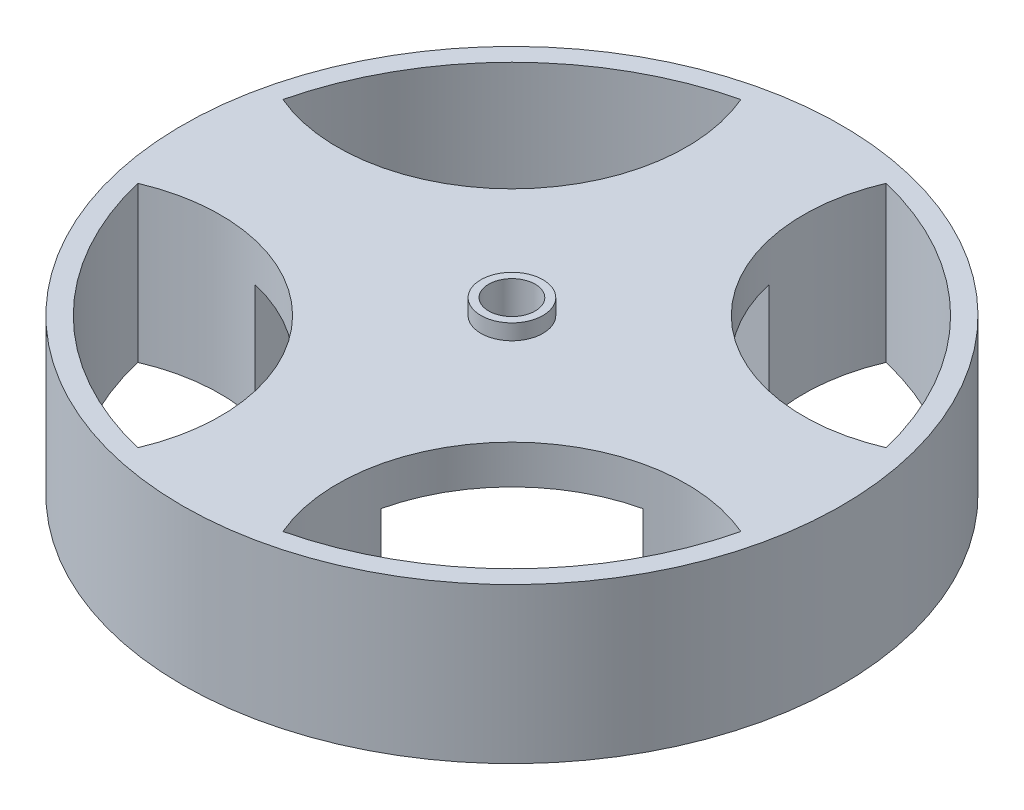
ISO-10303-21;
HEADER;
FILE_DESCRIPTION(('STEP AP214'),'2;1');
FILE_NAME('part.step','',(''),(''),'','','');
FILE_SCHEMA(('AUTOMOTIVE_DESIGN { 1 0 10303 214 1 1 1 1 }'));
ENDSEC;
DATA;
#1=APPLICATION_CONTEXT('core data for automotive mechanical design processes');
#2=APPLICATION_PROTOCOL_DEFINITION('international standard','automotive_design',2000,#1);
#3=PRODUCT_CONTEXT('',#1,'mechanical');
#4=PRODUCT('Part','Part','',(#3));
#5=PRODUCT_RELATED_PRODUCT_CATEGORY('part','',(#4));
#6=PRODUCT_DEFINITION_FORMATION('','',#4);
#7=PRODUCT_DEFINITION_CONTEXT('part definition',#1,'design');
#8=PRODUCT_DEFINITION('design','',#6,#7);
#9=PRODUCT_DEFINITION_SHAPE('','',#8);
#10=(LENGTH_UNIT() NAMED_UNIT(*) SI_UNIT(.MILLI.,.METRE.));
#11=(NAMED_UNIT(*) PLANE_ANGLE_UNIT() SI_UNIT($,.RADIAN.));
#12=(NAMED_UNIT(*) SI_UNIT($,.STERADIAN.) SOLID_ANGLE_UNIT());
#13=UNCERTAINTY_MEASURE_WITH_UNIT(LENGTH_MEASURE(1.E-05),#10,'distance_accuracy_value','');
#14=(GEOMETRIC_REPRESENTATION_CONTEXT(3) GLOBAL_UNCERTAINTY_ASSIGNED_CONTEXT((#13)) GLOBAL_UNIT_ASSIGNED_CONTEXT((#10,
#11,#12)) REPRESENTATION_CONTEXT('',''));
#15=CARTESIAN_POINT('',(0.,0.,0.));
#16=DIRECTION('',(0.,0.,1.));
#17=DIRECTION('',(1.,0.,0.));
#18=AXIS2_PLACEMENT_3D('',#15,#16,#17);
#19=CARTESIAN_POINT('',(0.,10.,0.));
#20=DIRECTION('',(0.,-1.,0.));
#21=DIRECTION('',(0.,0.,-1.));
#22=AXIS2_PLACEMENT_3D('',#19,#20,#21);
#23=CYLINDRICAL_SURFACE('',#22,40.);
#24=CARTESIAN_POINT('',(0.,-10.,0.));
#25=DIRECTION('',(0.,1.,0.));
#26=DIRECTION('',(0.,0.,1.));
#27=AXIS2_PLACEMENT_3D('',#24,#25,#26);
#28=CIRCLE('',#27,40.);
#29=CARTESIAN_POINT('',(-9.36023088988098,-10.,-38.8894082969659));
#30=VERTEX_POINT('',#29);
#31=CARTESIAN_POINT('',(-38.8894082969659,-10.,-9.36023088988067));
#32=VERTEX_POINT('',#31);
#33=EDGE_CURVE('E69',#30,#32,#28,.T.);
#34=ORIENTED_EDGE('',*,*,#33,.F.);
#35=DIRECTION('',(0.,1.,0.));
#36=VECTOR('',#35,1.);
#37=CARTESIAN_POINT('',(-9.36023088988108,5.,-38.8894082969658));
#38=LINE('',#37,#36);
#39=CARTESIAN_POINT('',(-9.36023088988108,10.,-38.8894082969658));
#40=VERTEX_POINT('',#39);
#41=EDGE_CURVE('E224',#30,#40,#38,.T.);
#42=ORIENTED_EDGE('',*,*,#41,.T.);
#43=CARTESIAN_POINT('',(0.,10.,0.));
#44=DIRECTION('',(0.,1.,0.));
#45=DIRECTION('',(0.,0.,1.));
#46=AXIS2_PLACEMENT_3D('',#43,#44,#45);
#47=CIRCLE('',#46,40.);
#48=CARTESIAN_POINT('',(-38.8894082969659,10.,-9.36023088988067));
#49=VERTEX_POINT('',#48);
#50=EDGE_CURVE('E632',#40,#49,#47,.T.);
#51=ORIENTED_EDGE('',*,*,#50,.T.);
#52=DIRECTION('',(0.,1.,0.));
#53=VECTOR('',#52,1.);
#54=CARTESIAN_POINT('',(-38.889408296966,5.,-9.36023088988068));
#55=LINE('',#54,#53);
#56=EDGE_CURVE('E220',#32,#49,#55,.T.);
#57=ORIENTED_EDGE('',*,*,#56,.F.);
#58=EDGE_LOOP('',(#34,#42,#51,#57));
#59=FACE_BOUND('',#58,.T.);
#60=ADVANCED_FACE('F43',(#59),#23,.F.);
#61=DIRECTION('',(0.,1.,0.));
#62=VECTOR('',#61,1.);
#63=CARTESIAN_POINT('',(9.36023088988079,5.,-38.8894082969659));
#64=LINE('',#63,#62);
#65=CARTESIAN_POINT('',(9.36023088988068,-10.,-38.889408296966));
#66=VERTEX_POINT('',#65);
#67=CARTESIAN_POINT('',(9.36023088988078,10.,-38.8894082969659));
#68=VERTEX_POINT('',#67);
#69=EDGE_CURVE('E228',#66,#68,#64,.T.);
#70=ORIENTED_EDGE('',*,*,#69,.F.);
#71=CARTESIAN_POINT('',(38.8894082969659,-10.,-9.36023088988097));
#72=VERTEX_POINT('',#71);
#73=EDGE_CURVE('E362',#72,#66,#28,.T.);
#74=ORIENTED_EDGE('',*,*,#73,.F.);
#75=DIRECTION('',(0.,1.,0.));
#76=VECTOR('',#75,1.);
#77=CARTESIAN_POINT('',(38.8894082969659,5.,-9.36023088988096));
#78=LINE('',#77,#76);
#79=CARTESIAN_POINT('',(38.8894082969659,10.,-9.36023088988096));
#80=VERTEX_POINT('',#79);
#81=EDGE_CURVE('E232',#72,#80,#78,.T.);
#82=ORIENTED_EDGE('',*,*,#81,.T.);
#83=EDGE_CURVE('E250',#80,#68,#47,.T.);
#84=ORIENTED_EDGE('',*,*,#83,.T.);
#85=EDGE_LOOP('',(#70,#74,#82,#84));
#86=FACE_BOUND('',#85,.T.);
#87=ADVANCED_FACE('F371',(#86),#23,.F.);
#88=CARTESIAN_POINT('',(-15.0260191002141,5.,15.0260191002142));
#89=DIRECTION('',(0.,1.,0.));
#90=DIRECTION('',(0.,0.,1.));
#91=AXIS2_PLACEMENT_3D('',#88,#89,#90);
#92=PLANE('',#91);
#93=CARTESIAN_POINT('',(0.,5.,0.));
#94=DIRECTION('',(0.,1.,0.));
#95=DIRECTION('',(0.,0.,1.));
#96=AXIS2_PLACEMENT_3D('',#93,#94,#95);
#97=CIRCLE('',#96,3.);
#98=CARTESIAN_POINT('',(0.,5.,3.));
#99=VERTEX_POINT('',#98);
#100=EDGE_CURVE('E47',#99,#99,#97,.T.);
#101=ORIENTED_EDGE('',*,*,#100,.T.);
#102=EDGE_LOOP('',(#101));
#103=FACE_BOUND('',#102,.T.);
#104=DIRECTION('',(-1.,0.,0.));
#105=VECTOR('',#104,1.);
#106=CARTESIAN_POINT('',(8.12655280052393,5.,-25.));
#107=LINE('',#106,#105);
#108=CARTESIAN_POINT('',(8.12655280052393,5.,-25.));
#109=VERTEX_POINT('',#108);
#110=CARTESIAN_POINT('',(-8.12655280052409,5.,-25.));
#111=VERTEX_POINT('',#110);
#112=EDGE_CURVE('E162',#109,#111,#107,.T.);
#113=ORIENTED_EDGE('',*,*,#112,.F.);
#114=CARTESIAN_POINT('',(30.0520382004282,5.,-30.0520382004283));
#115=DIRECTION('',(0.,-1.,0.));
#116=DIRECTION('',(0.,0.,1.));
#117=AXIS2_PLACEMENT_3D('',#114,#115,#116);
#118=CIRCLE('',#117,22.5);
#119=CARTESIAN_POINT('',(25.,5.,-8.12655280052409));
#120=VERTEX_POINT('',#119);
#121=EDGE_CURVE('E192',#120,#109,#118,.T.);
#122=ORIENTED_EDGE('',*,*,#121,.F.);
#123=DIRECTION('',(0.,0.,-1.));
#124=VECTOR('',#123,1.);
#125=CARTESIAN_POINT('',(25.,5.,8.12655280052393));
#126=LINE('',#125,#124);
#127=CARTESIAN_POINT('',(25.,5.,8.12655280052393));
#128=VERTEX_POINT('',#127);
#129=EDGE_CURVE('E331',#128,#120,#126,.T.);
#130=ORIENTED_EDGE('',*,*,#129,.F.);
#131=CARTESIAN_POINT('',(30.0520382004284,5.,30.0520382004281));
#132=DIRECTION('',(0.,-1.,0.));
#133=DIRECTION('',(0.,0.,1.));
#134=AXIS2_PLACEMENT_3D('',#131,#132,#133);
#135=CIRCLE('',#134,22.5);
#136=CARTESIAN_POINT('',(8.12655280052409,5.,25.));
#137=VERTEX_POINT('',#136);
#138=EDGE_CURVE('E198',#137,#128,#135,.T.);
#139=ORIENTED_EDGE('',*,*,#138,.F.);
#140=DIRECTION('',(1.,0.,0.));
#141=VECTOR('',#140,1.);
#142=CARTESIAN_POINT('',(-8.12655280052392,5.,25.));
#143=LINE('',#142,#141);
#144=CARTESIAN_POINT('',(-8.12655280052392,5.,25.));
#145=VERTEX_POINT('',#144);
#146=EDGE_CURVE('E282',#145,#137,#143,.T.);
#147=ORIENTED_EDGE('',*,*,#146,.F.);
#148=CARTESIAN_POINT('',(-30.0520382004282,5.,30.0520382004283));
#149=DIRECTION('',(0.,-1.,0.));
#150=DIRECTION('',(0.,0.,1.));
#151=AXIS2_PLACEMENT_3D('',#148,#149,#150);
#152=CIRCLE('',#151,22.5);
#153=CARTESIAN_POINT('',(-25.,5.,8.12655280052409));
#154=VERTEX_POINT('',#153);
#155=EDGE_CURVE('E219',#154,#145,#152,.T.);
#156=ORIENTED_EDGE('',*,*,#155,.F.);
#157=DIRECTION('',(0.,0.,1.));
#158=VECTOR('',#157,1.);
#159=CARTESIAN_POINT('',(-25.,5.,-8.12655280052392));
#160=LINE('',#159,#158);
#161=CARTESIAN_POINT('',(-25.,5.,-8.12655280052392));
#162=VERTEX_POINT('',#161);
#163=EDGE_CURVE('E189',#162,#154,#160,.T.);
#164=ORIENTED_EDGE('',*,*,#163,.F.);
#165=CARTESIAN_POINT('',(-30.0520382004284,5.,-30.0520382004281));
#166=DIRECTION('',(0.,-1.,0.));
#167=DIRECTION('',(0.,0.,1.));
#168=AXIS2_PLACEMENT_3D('',#165,#166,#167);
#169=CIRCLE('',#168,22.5);
#170=EDGE_CURVE('E182',#111,#162,#169,.T.);
#171=ORIENTED_EDGE('',*,*,#170,.F.);
#172=EDGE_LOOP('',(#113,#122,#130,#139,#147,#156,#164,#171));
#173=FACE_BOUND('',#172,.T.);
#174=ADVANCED_FACE('F187',(#103,#173),#92,.F.);
#175=DIRECTION('',(0.,1.,0.));
#176=VECTOR('',#175,1.);
#177=CARTESIAN_POINT('',(38.8894082969659,5.,9.36023088988063));
#178=LINE('',#177,#176);
#179=CARTESIAN_POINT('',(38.8894082969659,-10.,9.36023088988068));
#180=VERTEX_POINT('',#179);
#181=CARTESIAN_POINT('',(38.889408296966,10.,9.36023088988064));
#182=VERTEX_POINT('',#181);
#183=EDGE_CURVE('E236',#180,#182,#178,.T.);
#184=ORIENTED_EDGE('',*,*,#183,.F.);
#185=CARTESIAN_POINT('',(9.36023088988097,-10.,38.8894082969659));
#186=VERTEX_POINT('',#185);
#187=EDGE_CURVE('E255',#186,#180,#28,.T.);
#188=ORIENTED_EDGE('',*,*,#187,.F.);
#189=DIRECTION('',(0.,1.,0.));
#190=VECTOR('',#189,1.);
#191=CARTESIAN_POINT('',(9.36023088988111,5.,38.8894082969658));
#192=LINE('',#191,#190);
#193=CARTESIAN_POINT('',(9.36023088988111,10.,38.8894082969658));
#194=VERTEX_POINT('',#193);
#195=EDGE_CURVE('E240',#186,#194,#192,.T.);
#196=ORIENTED_EDGE('',*,*,#195,.T.);
#197=EDGE_CURVE('E247',#194,#182,#47,.T.);
#198=ORIENTED_EDGE('',*,*,#197,.T.);
#199=EDGE_LOOP('',(#184,#188,#196,#198));
#200=FACE_BOUND('',#199,.T.);
#201=ADVANCED_FACE('F360',(#200),#23,.F.);
#202=DIRECTION('',(0.,1.,0.));
#203=VECTOR('',#202,1.);
#204=CARTESIAN_POINT('',(-9.36023088988079,5.,38.8894082969659));
#205=LINE('',#204,#203);
#206=CARTESIAN_POINT('',(-9.36023088988067,-10.,38.8894082969659));
#207=VERTEX_POINT('',#206);
#208=CARTESIAN_POINT('',(-9.36023088988079,10.,38.8894082969659));
#209=VERTEX_POINT('',#208);
#210=EDGE_CURVE('E196',#207,#209,#205,.T.);
#211=ORIENTED_EDGE('',*,*,#210,.F.);
#212=CARTESIAN_POINT('',(-38.8894082969659,-10.,9.36023088988097));
#213=VERTEX_POINT('',#212);
#214=EDGE_CURVE('E252',#213,#207,#28,.T.);
#215=ORIENTED_EDGE('',*,*,#214,.F.);
#216=DIRECTION('',(0.,1.,0.));
#217=VECTOR('',#216,1.);
#218=CARTESIAN_POINT('',(-38.8894082969659,5.,9.36023088988096));
#219=LINE('',#218,#217);
#220=CARTESIAN_POINT('',(-38.8894082969659,10.,9.36023088988096));
#221=VERTEX_POINT('',#220);
#222=EDGE_CURVE('E61',#213,#221,#219,.T.);
#223=ORIENTED_EDGE('',*,*,#222,.T.);
#224=EDGE_CURVE('E251',#221,#209,#47,.T.);
#225=ORIENTED_EDGE('',*,*,#224,.T.);
#226=EDGE_LOOP('',(#211,#215,#223,#225));
#227=FACE_BOUND('',#226,.T.);
#228=ADVANCED_FACE('F270',(#227),#23,.F.);
#229=CARTESIAN_POINT('',(0.,10.,0.));
#230=DIRECTION('',(0.,1.,0.));
#231=DIRECTION('',(0.,0.,1.));
#232=AXIS2_PLACEMENT_3D('',#229,#230,#231);
#233=PLANE('',#232);
#234=CARTESIAN_POINT('',(0.,10.,0.));
#235=DIRECTION('',(0.,1.,0.));
#236=DIRECTION('',(0.,0.,1.));
#237=AXIS2_PLACEMENT_3D('',#234,#235,#236);
#238=CIRCLE('',#237,4.);
#239=CARTESIAN_POINT('',(0.,10.,4.));
#240=VERTEX_POINT('',#239);
#241=EDGE_CURVE('E309',#240,#240,#238,.T.);
#242=ORIENTED_EDGE('',*,*,#241,.F.);
#243=EDGE_LOOP('',(#242));
#244=FACE_BOUND('',#243,.T.);
#245=ORIENTED_EDGE('',*,*,#83,.F.);
#246=CARTESIAN_POINT('',(30.0520382004282,10.,-30.0520382004283));
#247=DIRECTION('',(0.,-1.,0.));
#248=DIRECTION('',(0.,0.,1.));
#249=AXIS2_PLACEMENT_3D('',#246,#247,#248);
#250=CIRCLE('',#249,22.5);
#251=EDGE_CURVE('E211',#80,#68,#250,.T.);
#252=ORIENTED_EDGE('',*,*,#251,.T.);
#253=EDGE_LOOP('',(#245,#252));
#254=FACE_BOUND('',#253,.T.);
#255=ORIENTED_EDGE('',*,*,#50,.F.);
#256=CARTESIAN_POINT('',(-30.0520382004284,10.,-30.0520382004281));
#257=DIRECTION('',(0.,-1.,0.));
#258=DIRECTION('',(0.,0.,1.));
#259=AXIS2_PLACEMENT_3D('',#256,#257,#258);
#260=CIRCLE('',#259,22.5);
#261=EDGE_CURVE('E215',#40,#49,#260,.T.);
#262=ORIENTED_EDGE('',*,*,#261,.T.);
#263=EDGE_LOOP('',(#255,#262));
#264=FACE_BOUND('',#263,.T.);
#265=ORIENTED_EDGE('',*,*,#224,.F.);
#266=CARTESIAN_POINT('',(-30.0520382004282,10.,30.0520382004283));
#267=DIRECTION('',(0.,-1.,0.));
#268=DIRECTION('',(0.,0.,1.));
#269=AXIS2_PLACEMENT_3D('',#266,#267,#268);
#270=CIRCLE('',#269,22.5);
#271=EDGE_CURVE('E202',#221,#209,#270,.T.);
#272=ORIENTED_EDGE('',*,*,#271,.T.);
#273=EDGE_LOOP('',(#265,#272));
#274=FACE_BOUND('',#273,.T.);
#275=CARTESIAN_POINT('',(0.,10.,0.));
#276=DIRECTION('',(0.,1.,0.));
#277=DIRECTION('',(0.,0.,1.));
#278=AXIS2_PLACEMENT_3D('',#275,#276,#277);
#279=CIRCLE('',#278,42.5);
#280=CARTESIAN_POINT('',(0.,10.,42.5));
#281=VERTEX_POINT('',#280);
#282=EDGE_CURVE('E11',#281,#281,#279,.T.);
#283=ORIENTED_EDGE('',*,*,#282,.T.);
#284=EDGE_LOOP('',(#283));
#285=FACE_BOUND('',#284,.T.);
#286=ORIENTED_EDGE('',*,*,#197,.F.);
#287=CARTESIAN_POINT('',(30.0520382004284,10.,30.0520382004281));
#288=DIRECTION('',(0.,-1.,0.));
#289=DIRECTION('',(0.,0.,1.));
#290=AXIS2_PLACEMENT_3D('',#287,#288,#289);
#291=CIRCLE('',#290,22.5);
#292=EDGE_CURVE('E206',#194,#182,#291,.T.);
#293=ORIENTED_EDGE('',*,*,#292,.T.);
#294=EDGE_LOOP('',(#286,#293));
#295=FACE_BOUND('',#294,.T.);
#296=ADVANCED_FACE('F263',(#244,#254,#264,#274,#285,#295),#233,.T.);
#297=CARTESIAN_POINT('',(0.,-10.,0.));
#298=DIRECTION('',(0.,1.,0.));
#299=DIRECTION('',(0.,0.,1.));
#300=AXIS2_PLACEMENT_3D('',#297,#298,#299);
#301=PLANE('',#300);
#302=CARTESIAN_POINT('',(0.,-10.,0.));
#303=DIRECTION('',(0.,1.,0.));
#304=DIRECTION('',(0.,0.,1.));
#305=AXIS2_PLACEMENT_3D('',#302,#303,#304);
#306=CIRCLE('',#305,42.5);
#307=CARTESIAN_POINT('',(0.,-10.,42.5));
#308=VERTEX_POINT('',#307);
#309=EDGE_CURVE('E53',#308,#308,#306,.T.);
#310=ORIENTED_EDGE('',*,*,#309,.F.);
#311=EDGE_LOOP('',(#310));
#312=FACE_BOUND('',#311,.T.);
#313=ORIENTED_EDGE('',*,*,#214,.T.);
#314=CARTESIAN_POINT('',(-30.0520382004281,-10.,30.0520382004284));
#315=DIRECTION('',(0.,1.,0.));
#316=DIRECTION('',(0.,0.,-1.));
#317=AXIS2_PLACEMENT_3D('',#314,#315,#316);
#318=CIRCLE('',#317,22.5);
#319=CARTESIAN_POINT('',(-8.12655280052392,-10.,25.));
#320=VERTEX_POINT('',#319);
#321=EDGE_CURVE('E266',#207,#320,#318,.T.);
#322=ORIENTED_EDGE('',*,*,#321,.T.);
#323=DIRECTION('',(1.,0.,0.));
#324=VECTOR('',#323,1.);
#325=CARTESIAN_POINT('',(-8.12655280052392,-10.,25.));
#326=LINE('',#325,#324);
#327=CARTESIAN_POINT('',(8.12655280052409,-10.,25.));
#328=VERTEX_POINT('',#327);
#329=EDGE_CURVE('E277',#320,#328,#326,.T.);
#330=ORIENTED_EDGE('',*,*,#329,.T.);
#331=CARTESIAN_POINT('',(30.0520382004283,-10.,30.0520382004282));
#332=DIRECTION('',(0.,1.,0.));
#333=DIRECTION('',(0.,0.,-1.));
#334=AXIS2_PLACEMENT_3D('',#331,#332,#333);
#335=CIRCLE('',#334,22.5);
#336=EDGE_CURVE('E276',#328,#186,#335,.T.);
#337=ORIENTED_EDGE('',*,*,#336,.T.);
#338=ORIENTED_EDGE('',*,*,#187,.T.);
#339=CARTESIAN_POINT('',(30.0520382004284,-10.,30.0520382004281));
#340=DIRECTION('',(0.,1.,0.));
#341=DIRECTION('',(0.,0.,-1.));
#342=AXIS2_PLACEMENT_3D('',#339,#340,#341);
#343=CIRCLE('',#342,22.5);
#344=CARTESIAN_POINT('',(25.,-10.,8.12655280052393));
#345=VERTEX_POINT('',#344);
#346=EDGE_CURVE('E342',#180,#345,#343,.T.);
#347=ORIENTED_EDGE('',*,*,#346,.T.);
#348=DIRECTION('',(0.,0.,-1.));
#349=VECTOR('',#348,1.);
#350=CARTESIAN_POINT('',(25.,-10.,8.12655280052393));
#351=LINE('',#350,#349);
#352=CARTESIAN_POINT('',(25.,-10.,-8.12655280052409));
#353=VERTEX_POINT('',#352);
#354=EDGE_CURVE('E348',#345,#353,#351,.T.);
#355=ORIENTED_EDGE('',*,*,#354,.T.);
#356=CARTESIAN_POINT('',(30.0520382004282,-10.,-30.0520382004283));
#357=DIRECTION('',(0.,1.,0.));
#358=DIRECTION('',(0.,0.,-1.));
#359=AXIS2_PLACEMENT_3D('',#356,#357,#358);
#360=CIRCLE('',#359,22.5);
#361=EDGE_CURVE('E336',#353,#72,#360,.T.);
#362=ORIENTED_EDGE('',*,*,#361,.T.);
#363=ORIENTED_EDGE('',*,*,#73,.T.);
#364=CARTESIAN_POINT('',(30.0520382004281,-10.,-30.0520382004284));
#365=DIRECTION('',(0.,1.,0.));
#366=DIRECTION('',(0.,0.,-1.));
#367=AXIS2_PLACEMENT_3D('',#364,#365,#366);
#368=CIRCLE('',#367,22.5);
#369=CARTESIAN_POINT('',(8.12655280052393,-10.,-25.));
#370=VERTEX_POINT('',#369);
#371=EDGE_CURVE('E368',#66,#370,#368,.T.);
#372=ORIENTED_EDGE('',*,*,#371,.T.);
#373=DIRECTION('',(-1.,0.,0.));
#374=VECTOR('',#373,1.);
#375=CARTESIAN_POINT('',(8.12655280052393,-10.,-25.));
#376=LINE('',#375,#374);
#377=CARTESIAN_POINT('',(-8.12655280052409,-10.,-25.));
#378=VERTEX_POINT('',#377);
#379=EDGE_CURVE('E185',#370,#378,#376,.T.);
#380=ORIENTED_EDGE('',*,*,#379,.T.);
#381=CARTESIAN_POINT('',(-30.0520382004283,-10.,-30.0520382004282));
#382=DIRECTION('',(0.,1.,0.));
#383=DIRECTION('',(0.,0.,-1.));
#384=AXIS2_PLACEMENT_3D('',#381,#382,#383);
#385=CIRCLE('',#384,22.5);
#386=EDGE_CURVE('E176',#378,#30,#385,.T.);
#387=ORIENTED_EDGE('',*,*,#386,.T.);
#388=ORIENTED_EDGE('',*,*,#33,.T.);
#389=CARTESIAN_POINT('',(-30.0520382004284,-10.,-30.0520382004281));
#390=DIRECTION('',(0.,1.,0.));
#391=DIRECTION('',(0.,0.,-1.));
#392=AXIS2_PLACEMENT_3D('',#389,#390,#391);
#393=CIRCLE('',#392,22.5);
#394=CARTESIAN_POINT('',(-25.,-10.,-8.12655280052392));
#395=VERTEX_POINT('',#394);
#396=EDGE_CURVE('E290',#32,#395,#393,.T.);
#397=ORIENTED_EDGE('',*,*,#396,.T.);
#398=DIRECTION('',(0.,0.,1.));
#399=VECTOR('',#398,1.);
#400=CARTESIAN_POINT('',(-25.,-10.,-8.12655280052392));
#401=LINE('',#400,#399);
#402=CARTESIAN_POINT('',(-25.,-10.,8.12655280052409));
#403=VERTEX_POINT('',#402);
#404=EDGE_CURVE('E293',#395,#403,#401,.T.);
#405=ORIENTED_EDGE('',*,*,#404,.T.);
#406=CARTESIAN_POINT('',(-30.0520382004282,-10.,30.0520382004283));
#407=DIRECTION('',(0.,1.,0.));
#408=DIRECTION('',(0.,0.,-1.));
#409=AXIS2_PLACEMENT_3D('',#406,#407,#408);
#410=CIRCLE('',#409,22.5);
#411=EDGE_CURVE('E268',#403,#213,#410,.T.);
#412=ORIENTED_EDGE('',*,*,#411,.T.);
#413=EDGE_LOOP('',(#313,#322,#330,#337,#338,#347,#355,#362,#363,#372,#380,#387,#388,#397,#405,#412));
#414=FACE_BOUND('',#413,.T.);
#415=ADVANCED_FACE('F261',(#312,#414),#301,.F.);
#416=CARTESIAN_POINT('',(0.,10.,0.));
#417=DIRECTION('',(0.,-1.,0.));
#418=DIRECTION('',(0.,0.,-1.));
#419=AXIS2_PLACEMENT_3D('',#416,#417,#418);
#420=CYLINDRICAL_SURFACE('',#419,42.5);
#421=ORIENTED_EDGE('',*,*,#282,.F.);
#422=EDGE_LOOP('',(#421));
#423=FACE_BOUND('',#422,.T.);
#424=ORIENTED_EDGE('',*,*,#309,.T.);
#425=EDGE_LOOP('',(#424));
#426=FACE_BOUND('',#425,.T.);
#427=ADVANCED_FACE('F45',(#423,#426),#420,.T.);
#428=CARTESIAN_POINT('',(-30.0520382004284,5.,-30.0520382004281));
#429=DIRECTION('',(0.,1.,0.));
#430=DIRECTION('',(0.,0.,1.));
#431=AXIS2_PLACEMENT_3D('',#428,#429,#430);
#432=CYLINDRICAL_SURFACE('',#431,22.5);
#433=ORIENTED_EDGE('',*,*,#261,.F.);
#434=ORIENTED_EDGE('',*,*,#41,.F.);
#435=ORIENTED_EDGE('',*,*,#386,.F.);
#436=DIRECTION('',(0.,1.,0.));
#437=VECTOR('',#436,1.);
#438=CARTESIAN_POINT('',(-8.12655280052409,-10.,-25.));
#439=LINE('',#438,#437);
#440=EDGE_CURVE('E166',#378,#111,#439,.T.);
#441=ORIENTED_EDGE('',*,*,#440,.T.);
#442=ORIENTED_EDGE('',*,*,#170,.T.);
#443=DIRECTION('',(0.,1.,0.));
#444=VECTOR('',#443,1.);
#445=CARTESIAN_POINT('',(-25.,-10.,-8.12655280052392));
#446=LINE('',#445,#444);
#447=EDGE_CURVE('E302',#395,#162,#446,.T.);
#448=ORIENTED_EDGE('',*,*,#447,.F.);
#449=ORIENTED_EDGE('',*,*,#396,.F.);
#450=ORIENTED_EDGE('',*,*,#56,.T.);
#451=EDGE_LOOP('',(#433,#434,#435,#441,#442,#448,#449,#450));
#452=FACE_BOUND('',#451,.T.);
#453=ADVANCED_FACE('F180',(#452),#432,.F.);
#454=CARTESIAN_POINT('',(30.0520382004282,5.,-30.0520382004283));
#455=DIRECTION('',(0.,1.,0.));
#456=DIRECTION('',(0.,0.,1.));
#457=AXIS2_PLACEMENT_3D('',#454,#455,#456);
#458=CYLINDRICAL_SURFACE('',#457,22.5);
#459=ORIENTED_EDGE('',*,*,#251,.F.);
#460=ORIENTED_EDGE('',*,*,#81,.F.);
#461=ORIENTED_EDGE('',*,*,#361,.F.);
#462=DIRECTION('',(0.,1.,0.));
#463=VECTOR('',#462,1.);
#464=CARTESIAN_POINT('',(25.,-10.,-8.12655280052409));
#465=LINE('',#464,#463);
#466=EDGE_CURVE('E346',#353,#120,#465,.T.);
#467=ORIENTED_EDGE('',*,*,#466,.T.);
#468=ORIENTED_EDGE('',*,*,#121,.T.);
#469=DIRECTION('',(0.,1.,0.));
#470=VECTOR('',#469,1.);
#471=CARTESIAN_POINT('',(8.12655280052393,-10.,-25.));
#472=LINE('',#471,#470);
#473=EDGE_CURVE('E169',#370,#109,#472,.T.);
#474=ORIENTED_EDGE('',*,*,#473,.F.);
#475=ORIENTED_EDGE('',*,*,#371,.F.);
#476=ORIENTED_EDGE('',*,*,#69,.T.);
#477=EDGE_LOOP('',(#459,#460,#461,#467,#468,#474,#475,#476));
#478=FACE_BOUND('',#477,.T.);
#479=ADVANCED_FACE('F374',(#478),#458,.F.);
#480=CARTESIAN_POINT('',(30.0520382004284,5.,30.0520382004281));
#481=DIRECTION('',(0.,1.,0.));
#482=DIRECTION('',(0.,0.,1.));
#483=AXIS2_PLACEMENT_3D('',#480,#481,#482);
#484=CYLINDRICAL_SURFACE('',#483,22.5);
#485=ORIENTED_EDGE('',*,*,#292,.F.);
#486=ORIENTED_EDGE('',*,*,#195,.F.);
#487=ORIENTED_EDGE('',*,*,#336,.F.);
#488=DIRECTION('',(0.,1.,0.));
#489=VECTOR('',#488,1.);
#490=CARTESIAN_POINT('',(8.12655280052409,-10.,25.));
#491=LINE('',#490,#489);
#492=EDGE_CURVE('E284',#328,#137,#491,.T.);
#493=ORIENTED_EDGE('',*,*,#492,.T.);
#494=ORIENTED_EDGE('',*,*,#138,.T.);
#495=DIRECTION('',(0.,1.,0.));
#496=VECTOR('',#495,1.);
#497=CARTESIAN_POINT('',(25.,-10.,8.12655280052393));
#498=LINE('',#497,#496);
#499=EDGE_CURVE('E175',#345,#128,#498,.T.);
#500=ORIENTED_EDGE('',*,*,#499,.F.);
#501=ORIENTED_EDGE('',*,*,#346,.F.);
#502=ORIENTED_EDGE('',*,*,#183,.T.);
#503=EDGE_LOOP('',(#485,#486,#487,#493,#494,#500,#501,#502));
#504=FACE_BOUND('',#503,.T.);
#505=ADVANCED_FACE('F324',(#504),#484,.F.);
#506=CARTESIAN_POINT('',(-30.0520382004282,5.,30.0520382004283));
#507=DIRECTION('',(0.,1.,0.));
#508=DIRECTION('',(0.,0.,1.));
#509=AXIS2_PLACEMENT_3D('',#506,#507,#508);
#510=CYLINDRICAL_SURFACE('',#509,22.5);
#511=ORIENTED_EDGE('',*,*,#271,.F.);
#512=ORIENTED_EDGE('',*,*,#222,.F.);
#513=ORIENTED_EDGE('',*,*,#411,.F.);
#514=DIRECTION('',(0.,1.,0.));
#515=VECTOR('',#514,1.);
#516=CARTESIAN_POINT('',(-25.,-10.,8.12655280052409));
#517=LINE('',#516,#515);
#518=EDGE_CURVE('E296',#403,#154,#517,.T.);
#519=ORIENTED_EDGE('',*,*,#518,.T.);
#520=ORIENTED_EDGE('',*,*,#155,.T.);
#521=DIRECTION('',(0.,1.,0.));
#522=VECTOR('',#521,1.);
#523=CARTESIAN_POINT('',(-8.12655280052392,-10.,25.));
#524=LINE('',#523,#522);
#525=EDGE_CURVE('E273',#320,#145,#524,.T.);
#526=ORIENTED_EDGE('',*,*,#525,.F.);
#527=ORIENTED_EDGE('',*,*,#321,.F.);
#528=ORIENTED_EDGE('',*,*,#210,.T.);
#529=EDGE_LOOP('',(#511,#512,#513,#519,#520,#526,#527,#528));
#530=FACE_BOUND('',#529,.T.);
#531=ADVANCED_FACE('F271',(#530),#510,.F.);
#532=CARTESIAN_POINT('',(0.,12.,0.));
#533=DIRECTION('',(0.,1.,0.));
#534=DIRECTION('',(0.,0.,1.));
#535=AXIS2_PLACEMENT_3D('',#532,#533,#534);
#536=PLANE('',#535);
#537=CARTESIAN_POINT('',(0.,12.,0.));
#538=DIRECTION('',(0.,1.,0.));
#539=DIRECTION('',(0.,0.,1.));
#540=AXIS2_PLACEMENT_3D('',#537,#538,#539);
#541=CIRCLE('',#540,4.);
#542=CARTESIAN_POINT('',(0.,12.,4.));
#543=VERTEX_POINT('',#542);
#544=EDGE_CURVE('E207',#543,#543,#541,.T.);
#545=ORIENTED_EDGE('',*,*,#544,.T.);
#546=EDGE_LOOP('',(#545));
#547=FACE_BOUND('',#546,.T.);
#548=CARTESIAN_POINT('',(0.,12.,0.));
#549=DIRECTION('',(0.,1.,0.));
#550=DIRECTION('',(0.,0.,1.));
#551=AXIS2_PLACEMENT_3D('',#548,#549,#550);
#552=CIRCLE('',#551,3.);
#553=CARTESIAN_POINT('',(0.,12.,3.));
#554=VERTEX_POINT('',#553);
#555=EDGE_CURVE('E305',#554,#554,#552,.T.);
#556=ORIENTED_EDGE('',*,*,#555,.F.);
#557=EDGE_LOOP('',(#556));
#558=FACE_BOUND('',#557,.T.);
#559=ADVANCED_FACE('F402',(#547,#558),#536,.T.);
#560=CARTESIAN_POINT('',(0.,12.,0.));
#561=DIRECTION('',(0.,-1.,0.));
#562=DIRECTION('',(0.,0.,-1.));
#563=AXIS2_PLACEMENT_3D('',#560,#561,#562);
#564=CYLINDRICAL_SURFACE('',#563,4.);
#565=ORIENTED_EDGE('',*,*,#544,.F.);
#566=EDGE_LOOP('',(#565));
#567=FACE_BOUND('',#566,.T.);
#568=ORIENTED_EDGE('',*,*,#241,.T.);
#569=EDGE_LOOP('',(#568));
#570=FACE_BOUND('',#569,.T.);
#571=ADVANCED_FACE('F412',(#567,#570),#564,.T.);
#572=CARTESIAN_POINT('',(0.,12.,0.));
#573=DIRECTION('',(0.,-1.,0.));
#574=DIRECTION('',(0.,0.,-1.));
#575=AXIS2_PLACEMENT_3D('',#572,#573,#574);
#576=CYLINDRICAL_SURFACE('',#575,3.);
#577=ORIENTED_EDGE('',*,*,#555,.T.);
#578=EDGE_LOOP('',(#577));
#579=FACE_BOUND('',#578,.T.);
#580=ORIENTED_EDGE('',*,*,#100,.F.);
#581=EDGE_LOOP('',(#580));
#582=FACE_BOUND('',#581,.T.);
#583=ADVANCED_FACE('F415',(#579,#582),#576,.F.);
#584=CARTESIAN_POINT('',(-25.,-10.,-8.12655280052392));
#585=DIRECTION('',(-1.,0.,0.));
#586=DIRECTION('',(0.,0.,1.));
#587=AXIS2_PLACEMENT_3D('',#584,#585,#586);
#588=PLANE('',#587);
#589=ORIENTED_EDGE('',*,*,#163,.T.);
#590=ORIENTED_EDGE('',*,*,#518,.F.);
#591=ORIENTED_EDGE('',*,*,#404,.F.);
#592=ORIENTED_EDGE('',*,*,#447,.T.);
#593=EDGE_LOOP('',(#589,#590,#591,#592));
#594=FACE_BOUND('',#593,.T.);
#595=ADVANCED_FACE('F422',(#594),#588,.F.);
#596=CARTESIAN_POINT('',(-8.12655280052392,-10.,25.));
#597=DIRECTION('',(0.,0.,1.));
#598=DIRECTION('',(1.,0.,0.));
#599=AXIS2_PLACEMENT_3D('',#596,#597,#598);
#600=PLANE('',#599);
#601=ORIENTED_EDGE('',*,*,#146,.T.);
#602=ORIENTED_EDGE('',*,*,#492,.F.);
#603=ORIENTED_EDGE('',*,*,#329,.F.);
#604=ORIENTED_EDGE('',*,*,#525,.T.);
#605=EDGE_LOOP('',(#601,#602,#603,#604));
#606=FACE_BOUND('',#605,.T.);
#607=ADVANCED_FACE('F356',(#606),#600,.F.);
#608=CARTESIAN_POINT('',(25.,-10.,8.12655280052393));
#609=DIRECTION('',(1.,0.,0.));
#610=DIRECTION('',(0.,0.,-1.));
#611=AXIS2_PLACEMENT_3D('',#608,#609,#610);
#612=PLANE('',#611);
#613=ORIENTED_EDGE('',*,*,#129,.T.);
#614=ORIENTED_EDGE('',*,*,#466,.F.);
#615=ORIENTED_EDGE('',*,*,#354,.F.);
#616=ORIENTED_EDGE('',*,*,#499,.T.);
#617=EDGE_LOOP('',(#613,#614,#615,#616));
#618=FACE_BOUND('',#617,.T.);
#619=ADVANCED_FACE('F383',(#618),#612,.F.);
#620=CARTESIAN_POINT('',(8.12655280052393,-10.,-25.));
#621=DIRECTION('',(0.,0.,-1.));
#622=DIRECTION('',(-1.,0.,0.));
#623=AXIS2_PLACEMENT_3D('',#620,#621,#622);
#624=PLANE('',#623);
#625=ORIENTED_EDGE('',*,*,#112,.T.);
#626=ORIENTED_EDGE('',*,*,#440,.F.);
#627=ORIENTED_EDGE('',*,*,#379,.F.);
#628=ORIENTED_EDGE('',*,*,#473,.T.);
#629=EDGE_LOOP('',(#625,#626,#627,#628));
#630=FACE_BOUND('',#629,.T.);
#631=ADVANCED_FACE('F164',(#630),#624,.F.);
#632=CLOSED_SHELL('',(#60,#87,#174,#201,#228,#296,#415,#427,#453,#479,#505,#531,#559,#571,#583,
#595,#607,#619,#631));
#633=MANIFOLD_SOLID_BREP('B2',#632);
#634=ADVANCED_BREP_SHAPE_REPRESENTATION('',(#18,#633),#14);
#635=SHAPE_DEFINITION_REPRESENTATION(#9,#634);
ENDSEC;
END-ISO-10303-21;
